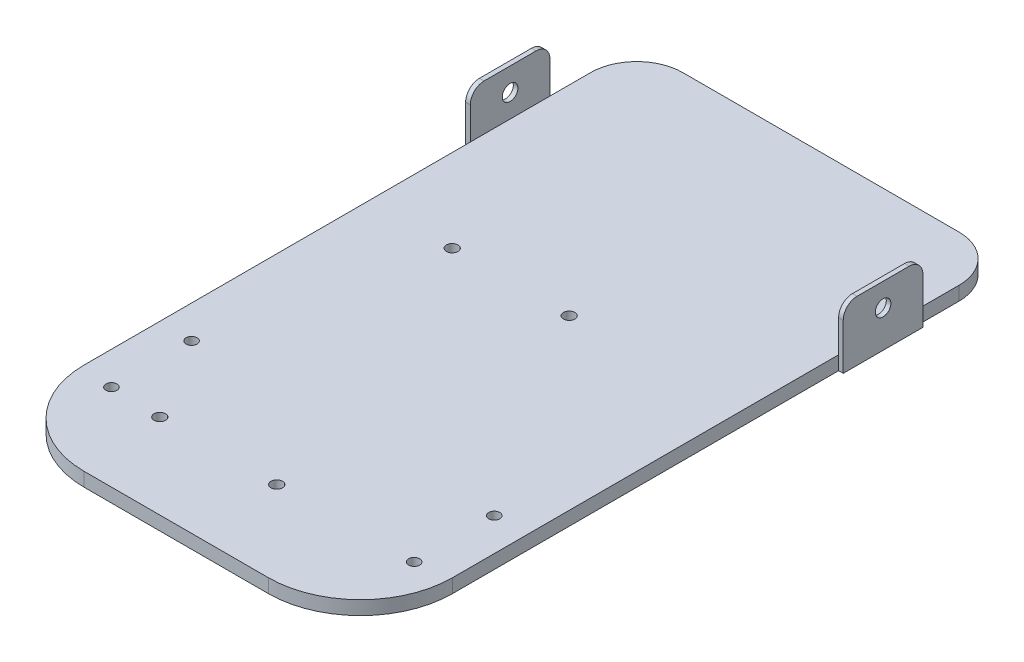
ISO-10303-21;
HEADER;
FILE_DESCRIPTION(('STEP AP214'),'2;1');
FILE_NAME('part.step','',(''),(''),'','','');
FILE_SCHEMA(('AUTOMOTIVE_DESIGN { 1 0 10303 214 1 1 1 1 }'));
ENDSEC;
DATA;
#1=APPLICATION_CONTEXT('core data for automotive mechanical design processes');
#2=APPLICATION_PROTOCOL_DEFINITION('international standard','automotive_design',2000,#1);
#3=PRODUCT_CONTEXT('',#1,'mechanical');
#4=PRODUCT('Part','Part','',(#3));
#5=PRODUCT_RELATED_PRODUCT_CATEGORY('part','',(#4));
#6=PRODUCT_DEFINITION_FORMATION('','',#4);
#7=PRODUCT_DEFINITION_CONTEXT('part definition',#1,'design');
#8=PRODUCT_DEFINITION('design','',#6,#7);
#9=PRODUCT_DEFINITION_SHAPE('','',#8);
#10=(LENGTH_UNIT() NAMED_UNIT(*) SI_UNIT(.MILLI.,.METRE.));
#11=(NAMED_UNIT(*) PLANE_ANGLE_UNIT() SI_UNIT($,.RADIAN.));
#12=(NAMED_UNIT(*) SI_UNIT($,.STERADIAN.) SOLID_ANGLE_UNIT());
#13=UNCERTAINTY_MEASURE_WITH_UNIT(LENGTH_MEASURE(1.E-05),#10,'distance_accuracy_value','');
#14=(GEOMETRIC_REPRESENTATION_CONTEXT(3) GLOBAL_UNCERTAINTY_ASSIGNED_CONTEXT((#13)) GLOBAL_UNIT_ASSIGNED_CONTEXT((#10,
#11,#12)) REPRESENTATION_CONTEXT('',''));
#15=CARTESIAN_POINT('',(0.,0.,0.));
#16=DIRECTION('',(0.,0.,1.));
#17=DIRECTION('',(1.,0.,0.));
#18=AXIS2_PLACEMENT_3D('',#15,#16,#17);
#19=CARTESIAN_POINT('',(41.,-3.,-68.6215298477543));
#20=DIRECTION('',(1.,0.,0.));
#21=DIRECTION('',(0.,0.,-1.));
#22=AXIS2_PLACEMENT_3D('',#19,#20,#21);
#23=PLANE('',#22);
#24=DIRECTION('',(0.,0.,1.));
#25=VECTOR('',#24,1.);
#26=CARTESIAN_POINT('',(41.,10.,-85.9215298477543));
#27=LINE('',#26,#25);
#28=CARTESIAN_POINT('',(41.,10.,-82.9215298477543));
#29=VERTEX_POINT('',#28);
#30=CARTESIAN_POINT('',(41.,10.,-71.6215298477543));
#31=VERTEX_POINT('',#30);
#32=EDGE_CURVE('E391',#29,#31,#27,.T.);
#33=ORIENTED_EDGE('',*,*,#32,.T.);
#34=CARTESIAN_POINT('',(41.,7.,-71.6215298477543));
#35=DIRECTION('',(1.,0.,0.));
#36=DIRECTION('',(0.,0.,-1.));
#37=AXIS2_PLACEMENT_3D('',#34,#35,#36);
#38=CIRCLE('',#37,3.);
#39=CARTESIAN_POINT('',(41.,7.,-68.6215298477543));
#40=VERTEX_POINT('',#39);
#41=EDGE_CURVE('E45',#31,#40,#38,.T.);
#42=ORIENTED_EDGE('',*,*,#41,.T.);
#43=DIRECTION('',(0.,1.,0.));
#44=VECTOR('',#43,1.);
#45=CARTESIAN_POINT('',(41.,-3.,-68.6215298477543));
#46=LINE('',#45,#44);
#47=CARTESIAN_POINT('',(41.,-3.,-68.6215298477543));
#48=VERTEX_POINT('',#47);
#49=EDGE_CURVE('E321',#48,#40,#46,.T.);
#50=ORIENTED_EDGE('',*,*,#49,.F.);
#51=DIRECTION('',(0.,0.,-1.));
#52=VECTOR('',#51,1.);
#53=CARTESIAN_POINT('',(41.,-3.,-68.6215298477543));
#54=LINE('',#53,#52);
#55=CARTESIAN_POINT('',(41.,-3.,-85.9215298477543));
#56=VERTEX_POINT('',#55);
#57=EDGE_CURVE('E277',#48,#56,#54,.T.);
#58=ORIENTED_EDGE('',*,*,#57,.T.);
#59=DIRECTION('',(0.,1.,0.));
#60=VECTOR('',#59,1.);
#61=CARTESIAN_POINT('',(41.,-3.,-85.9215298477543));
#62=LINE('',#61,#60);
#63=CARTESIAN_POINT('',(41.,7.,-85.9215298477543));
#64=VERTEX_POINT('',#63);
#65=EDGE_CURVE('E318',#56,#64,#62,.T.);
#66=ORIENTED_EDGE('',*,*,#65,.T.);
#67=CARTESIAN_POINT('',(41.,7.,-82.9215298477543));
#68=DIRECTION('',(1.,0.,0.));
#69=DIRECTION('',(0.,0.,-1.));
#70=AXIS2_PLACEMENT_3D('',#67,#68,#69);
#71=CIRCLE('',#70,3.);
#72=EDGE_CURVE('E52',#64,#29,#71,.T.);
#73=ORIENTED_EDGE('',*,*,#72,.T.);
#74=EDGE_LOOP('',(#33,#42,#50,#58,#66,#73));
#75=FACE_BOUND('',#74,.T.);
#76=CARTESIAN_POINT('',(41.,5.,-77.2715298477543));
#77=DIRECTION('',(1.,0.,0.));
#78=DIRECTION('',(0.,0.,-1.));
#79=AXIS2_PLACEMENT_3D('',#76,#77,#78);
#80=CIRCLE('',#79,1.7);
#81=CARTESIAN_POINT('',(41.,5.,-78.9715298477543));
#82=VERTEX_POINT('',#81);
#83=EDGE_CURVE('E416',#82,#82,#80,.T.);
#84=ORIENTED_EDGE('',*,*,#83,.F.);
#85=EDGE_LOOP('',(#84));
#86=FACE_BOUND('',#85,.T.);
#87=ADVANCED_FACE('F37',(#75,#86),#23,.T.);
#88=CARTESIAN_POINT('',(40.,10.,-85.9215298477543));
#89=DIRECTION('',(-1.,0.,0.));
#90=DIRECTION('',(0.,0.,1.));
#91=AXIS2_PLACEMENT_3D('',#88,#89,#90);
#92=PLANE('',#91);
#93=DIRECTION('',(0.,-1.,0.));
#94=VECTOR('',#93,1.);
#95=CARTESIAN_POINT('',(40.,10.,-68.6215298477543));
#96=LINE('',#95,#94);
#97=CARTESIAN_POINT('',(40.,7.,-68.6215298477543));
#98=VERTEX_POINT('',#97);
#99=CARTESIAN_POINT('',(40.,0.,-68.6215298477543));
#100=VERTEX_POINT('',#99);
#101=EDGE_CURVE('E407',#98,#100,#96,.T.);
#102=ORIENTED_EDGE('',*,*,#101,.F.);
#103=CARTESIAN_POINT('',(40.,7.,-71.6215298477543));
#104=DIRECTION('',(-1.,0.,0.));
#105=DIRECTION('',(0.,0.,1.));
#106=AXIS2_PLACEMENT_3D('',#103,#104,#105);
#107=CIRCLE('',#106,3.);
#108=CARTESIAN_POINT('',(40.,10.,-71.6215298477543));
#109=VERTEX_POINT('',#108);
#110=EDGE_CURVE('E382',#98,#109,#107,.T.);
#111=ORIENTED_EDGE('',*,*,#110,.T.);
#112=DIRECTION('',(0.,0.,-1.));
#113=VECTOR('',#112,1.);
#114=CARTESIAN_POINT('',(40.,10.,-85.9215298477543));
#115=LINE('',#114,#113);
#116=CARTESIAN_POINT('',(40.,10.,-82.9215298477543));
#117=VERTEX_POINT('',#116);
#118=EDGE_CURVE('E404',#109,#117,#115,.T.);
#119=ORIENTED_EDGE('',*,*,#118,.T.);
#120=CARTESIAN_POINT('',(40.,7.,-82.9215298477543));
#121=DIRECTION('',(-1.,0.,0.));
#122=DIRECTION('',(0.,0.,1.));
#123=AXIS2_PLACEMENT_3D('',#120,#121,#122);
#124=CIRCLE('',#123,3.);
#125=CARTESIAN_POINT('',(40.,7.,-85.9215298477543));
#126=VERTEX_POINT('',#125);
#127=EDGE_CURVE('E380',#117,#126,#124,.T.);
#128=ORIENTED_EDGE('',*,*,#127,.T.);
#129=DIRECTION('',(0.,-1.,0.));
#130=VECTOR('',#129,1.);
#131=CARTESIAN_POINT('',(40.,10.,-85.9215298477543));
#132=LINE('',#131,#130);
#133=CARTESIAN_POINT('',(40.,0.,-85.9215298477543));
#134=VERTEX_POINT('',#133);
#135=EDGE_CURVE('E410',#126,#134,#132,.T.);
#136=ORIENTED_EDGE('',*,*,#135,.T.);
#137=DIRECTION('',(0.,0.,-1.));
#138=VECTOR('',#137,1.);
#139=CARTESIAN_POINT('',(40.,0.,-85.9215298477543));
#140=LINE('',#139,#138);
#141=EDGE_CURVE('E412',#100,#134,#140,.T.);
#142=ORIENTED_EDGE('',*,*,#141,.F.);
#143=EDGE_LOOP('',(#102,#111,#119,#128,#136,#142));
#144=FACE_BOUND('',#143,.T.);
#145=CARTESIAN_POINT('',(40.,5.,-77.2715298477543));
#146=DIRECTION('',(1.,0.,0.));
#147=DIRECTION('',(0.,0.,-1.));
#148=AXIS2_PLACEMENT_3D('',#145,#146,#147);
#149=CIRCLE('',#148,1.7);
#150=CARTESIAN_POINT('',(40.,5.,-78.9715298477543));
#151=VERTEX_POINT('',#150);
#152=EDGE_CURVE('E803',#151,#151,#149,.T.);
#153=ORIENTED_EDGE('',*,*,#152,.T.);
#154=EDGE_LOOP('',(#153));
#155=FACE_BOUND('',#154,.T.);
#156=ADVANCED_FACE('F402',(#144,#155),#92,.T.);
#157=CARTESIAN_POINT('',(0.,-3.,0.));
#158=DIRECTION('',(0.,1.,0.));
#159=DIRECTION('',(0.,0.,1.));
#160=AXIS2_PLACEMENT_3D('',#157,#158,#159);
#161=PLANE('',#160);
#162=CARTESIAN_POINT('',(-22.,-3.,16.8002279588532));
#163=DIRECTION('',(0.,1.,0.));
#164=DIRECTION('',(0.,0.,1.));
#165=AXIS2_PLACEMENT_3D('',#162,#163,#164);
#166=CIRCLE('',#165,1.24999999999999);
#167=CARTESIAN_POINT('',(-22.,-3.,18.0502279588532));
#168=VERTEX_POINT('',#167);
#169=EDGE_CURVE('E778',#168,#168,#166,.T.);
#170=ORIENTED_EDGE('',*,*,#169,.T.);
#171=EDGE_LOOP('',(#170));
#172=FACE_BOUND('',#171,.T.);
#173=CARTESIAN_POINT('',(3.4,-3.,16.8002279588532));
#174=DIRECTION('',(0.,1.,0.));
#175=DIRECTION('',(0.,0.,1.));
#176=AXIS2_PLACEMENT_3D('',#173,#174,#175);
#177=CIRCLE('',#176,1.24999999999999);
#178=CARTESIAN_POINT('',(3.4,-3.,18.0502279588532));
#179=VERTEX_POINT('',#178);
#180=EDGE_CURVE('E788',#179,#179,#177,.T.);
#181=ORIENTED_EDGE('',*,*,#180,.T.);
#182=EDGE_LOOP('',(#181));
#183=FACE_BOUND('',#182,.T.);
#184=CARTESIAN_POINT('',(3.4,-3.,-46.6997720411468));
#185=DIRECTION('',(0.,1.,0.));
#186=DIRECTION('',(0.,0.,1.));
#187=AXIS2_PLACEMENT_3D('',#184,#185,#186);
#188=CIRCLE('',#187,1.24999999999999);
#189=CARTESIAN_POINT('',(3.4,-3.,-45.4497720411468));
#190=VERTEX_POINT('',#189);
#191=EDGE_CURVE('E794',#190,#190,#188,.T.);
#192=ORIENTED_EDGE('',*,*,#191,.T.);
#193=EDGE_LOOP('',(#192));
#194=FACE_BOUND('',#193,.T.);
#195=CARTESIAN_POINT('',(-22.,-3.,-46.6997720411468));
#196=DIRECTION('',(0.,1.,0.));
#197=DIRECTION('',(0.,0.,1.));
#198=AXIS2_PLACEMENT_3D('',#195,#196,#197);
#199=CIRCLE('',#198,1.24999999999999);
#200=CARTESIAN_POINT('',(-22.,-3.,-45.4497720411468));
#201=VERTEX_POINT('',#200);
#202=EDGE_CURVE('E800',#201,#201,#199,.T.);
#203=ORIENTED_EDGE('',*,*,#202,.T.);
#204=EDGE_LOOP('',(#203));
#205=FACE_BOUND('',#204,.T.);
#206=CARTESIAN_POINT('',(32.87,-3.,16.4284701522457));
#207=DIRECTION('',(0.,-1.,0.));
#208=DIRECTION('',(0.,0.,1.));
#209=AXIS2_PLACEMENT_3D('',#206,#207,#208);
#210=CIRCLE('',#209,1.2);
#211=CARTESIAN_POINT('',(32.87,-3.,17.6284701522457));
#212=VERTEX_POINT('',#211);
#213=EDGE_CURVE('E248',#212,#212,#210,.T.);
#214=ORIENTED_EDGE('',*,*,#213,.F.);
#215=EDGE_LOOP('',(#214));
#216=FACE_BOUND('',#215,.T.);
#217=CARTESIAN_POINT('',(-32.87,-3.,-0.971529847754317));
#218=DIRECTION('',(0.,1.,0.));
#219=DIRECTION('',(0.,0.,-1.));
#220=AXIS2_PLACEMENT_3D('',#217,#218,#219);
#221=CIRCLE('',#220,1.2);
#222=CARTESIAN_POINT('',(-32.87,-3.,-2.17152984775432));
#223=VERTEX_POINT('',#222);
#224=EDGE_CURVE('E254',#223,#223,#221,.T.);
#225=ORIENTED_EDGE('',*,*,#224,.T.);
#226=EDGE_LOOP('',(#225));
#227=FACE_BOUND('',#226,.T.);
#228=CARTESIAN_POINT('',(-32.87,-3.,16.4284701522457));
#229=DIRECTION('',(0.,1.,0.));
#230=DIRECTION('',(0.,0.,1.));
#231=AXIS2_PLACEMENT_3D('',#228,#229,#230);
#232=CIRCLE('',#231,1.2);
#233=CARTESIAN_POINT('',(-32.87,-3.,17.6284701522457));
#234=VERTEX_POINT('',#233);
#235=EDGE_CURVE('E260',#234,#234,#232,.T.);
#236=ORIENTED_EDGE('',*,*,#235,.T.);
#237=EDGE_LOOP('',(#236));
#238=FACE_BOUND('',#237,.T.);
#239=DIRECTION('',(-1.,0.,0.));
#240=VECTOR('',#239,1.);
#241=CARTESIAN_POINT('',(-40.,-3.,-104.771529847754));
#242=LINE('',#241,#240);
#243=CARTESIAN_POINT('',(30.,-3.,-104.771529847754));
#244=VERTEX_POINT('',#243);
#245=CARTESIAN_POINT('',(-30.,-3.,-104.771529847754));
#246=VERTEX_POINT('',#245);
#247=EDGE_CURVE('E286',#244,#246,#242,.T.);
#248=ORIENTED_EDGE('',*,*,#247,.F.);
#249=CARTESIAN_POINT('',(30.,-3.,-94.7715298477543));
#250=DIRECTION('',(0.,1.,0.));
#251=DIRECTION('',(0.,0.,1.));
#252=AXIS2_PLACEMENT_3D('',#249,#250,#251);
#253=CIRCLE('',#252,10.);
#254=CARTESIAN_POINT('',(40.,-3.,-94.7715298477543));
#255=VERTEX_POINT('',#254);
#256=EDGE_CURVE('E356',#244,#255,#253,.F.);
#257=ORIENTED_EDGE('',*,*,#256,.T.);
#258=DIRECTION('',(0.,0.,-1.));
#259=VECTOR('',#258,1.);
#260=CARTESIAN_POINT('',(40.,-3.,-85.9215298477543));
#261=LINE('',#260,#259);
#262=CARTESIAN_POINT('',(40.,-3.,-85.9215298477543));
#263=VERTEX_POINT('',#262);
#264=EDGE_CURVE('E283',#263,#255,#261,.T.);
#265=ORIENTED_EDGE('',*,*,#264,.F.);
#266=DIRECTION('',(-1.,0.,0.));
#267=VECTOR('',#266,1.);
#268=CARTESIAN_POINT('',(41.,-3.,-85.9215298477543));
#269=LINE('',#268,#267);
#270=EDGE_CURVE('E280',#56,#263,#269,.T.);
#271=ORIENTED_EDGE('',*,*,#270,.F.);
#272=ORIENTED_EDGE('',*,*,#57,.F.);
#273=DIRECTION('',(1.,0.,0.));
#274=VECTOR('',#273,1.);
#275=CARTESIAN_POINT('',(40.,-3.,-68.6215298477543));
#276=LINE('',#275,#274);
#277=CARTESIAN_POINT('',(40.,-3.,-68.6215298477543));
#278=VERTEX_POINT('',#277);
#279=EDGE_CURVE('E274',#278,#48,#276,.T.);
#280=ORIENTED_EDGE('',*,*,#279,.F.);
#281=DIRECTION('',(0.,0.,-1.));
#282=VECTOR('',#281,1.);
#283=CARTESIAN_POINT('',(40.,-3.,35.2284701522457));
#284=LINE('',#283,#282);
#285=CARTESIAN_POINT('',(40.,-3.,15.2284701522457));
#286=VERTEX_POINT('',#285);
#287=EDGE_CURVE('E272',#286,#278,#284,.T.);
#288=ORIENTED_EDGE('',*,*,#287,.F.);
#289=CARTESIAN_POINT('',(20.,-3.,15.2284701522457));
#290=DIRECTION('',(0.,1.,0.));
#291=DIRECTION('',(0.,0.,1.));
#292=AXIS2_PLACEMENT_3D('',#289,#290,#291);
#293=CIRCLE('',#292,20.);
#294=CARTESIAN_POINT('',(20.,-3.,35.2284701522457));
#295=VERTEX_POINT('',#294);
#296=EDGE_CURVE('E341',#286,#295,#293,.F.);
#297=ORIENTED_EDGE('',*,*,#296,.T.);
#298=DIRECTION('',(1.,0.,0.));
#299=VECTOR('',#298,1.);
#300=CARTESIAN_POINT('',(40.,-3.,35.2284701522457));
#301=LINE('',#300,#299);
#302=CARTESIAN_POINT('',(-20.,-3.,35.2284701522457));
#303=VERTEX_POINT('',#302);
#304=EDGE_CURVE('E269',#303,#295,#301,.T.);
#305=ORIENTED_EDGE('',*,*,#304,.F.);
#306=CARTESIAN_POINT('',(-20.,-3.,15.2284701522457));
#307=DIRECTION('',(0.,1.,0.));
#308=DIRECTION('',(0.,0.,1.));
#309=AXIS2_PLACEMENT_3D('',#306,#307,#308);
#310=CIRCLE('',#309,20.);
#311=CARTESIAN_POINT('',(-40.,-3.,15.2284701522457));
#312=VERTEX_POINT('',#311);
#313=EDGE_CURVE('E332',#303,#312,#310,.F.);
#314=ORIENTED_EDGE('',*,*,#313,.T.);
#315=DIRECTION('',(0.,0.,1.));
#316=VECTOR('',#315,1.);
#317=CARTESIAN_POINT('',(-40.,-3.,35.2284701522457));
#318=LINE('',#317,#316);
#319=CARTESIAN_POINT('',(-40.,-3.,-68.6215298477543));
#320=VERTEX_POINT('',#319);
#321=EDGE_CURVE('E266',#320,#312,#318,.T.);
#322=ORIENTED_EDGE('',*,*,#321,.F.);
#323=DIRECTION('',(1.,0.,0.));
#324=VECTOR('',#323,1.);
#325=CARTESIAN_POINT('',(-40.,-3.,-68.6215298477543));
#326=LINE('',#325,#324);
#327=CARTESIAN_POINT('',(-41.,-3.,-68.6215298477543));
#328=VERTEX_POINT('',#327);
#329=EDGE_CURVE('E295',#328,#320,#326,.T.);
#330=ORIENTED_EDGE('',*,*,#329,.F.);
#331=DIRECTION('',(0.,0.,1.));
#332=VECTOR('',#331,1.);
#333=CARTESIAN_POINT('',(-41.,-3.,-68.6215298477543));
#334=LINE('',#333,#332);
#335=CARTESIAN_POINT('',(-41.,-3.,-85.9215298477543));
#336=VERTEX_POINT('',#335);
#337=EDGE_CURVE('E292',#336,#328,#334,.T.);
#338=ORIENTED_EDGE('',*,*,#337,.F.);
#339=DIRECTION('',(-1.,0.,0.));
#340=VECTOR('',#339,1.);
#341=CARTESIAN_POINT('',(-41.,-3.,-85.9215298477543));
#342=LINE('',#341,#340);
#343=CARTESIAN_POINT('',(-40.,-3.,-85.9215298477543));
#344=VERTEX_POINT('',#343);
#345=EDGE_CURVE('E290',#344,#336,#342,.T.);
#346=ORIENTED_EDGE('',*,*,#345,.F.);
#347=DIRECTION('',(0.,0.,1.));
#348=VECTOR('',#347,1.);
#349=CARTESIAN_POINT('',(-40.,-3.,-85.9215298477543));
#350=LINE('',#349,#348);
#351=CARTESIAN_POINT('',(-40.,-3.,-94.7715298477543));
#352=VERTEX_POINT('',#351);
#353=EDGE_CURVE('E210',#352,#344,#350,.T.);
#354=ORIENTED_EDGE('',*,*,#353,.F.);
#355=CARTESIAN_POINT('',(-30.,-3.,-94.7715298477543));
#356=DIRECTION('',(0.,1.,0.));
#357=DIRECTION('',(0.,0.,1.));
#358=AXIS2_PLACEMENT_3D('',#355,#356,#357);
#359=CIRCLE('',#358,10.);
#360=EDGE_CURVE('E354',#352,#246,#359,.F.);
#361=ORIENTED_EDGE('',*,*,#360,.T.);
#362=EDGE_LOOP('',(#248,#257,#265,#271,#272,#280,#288,#297,#305,#314,#322,#330,#338,#346,#354,#361));
#363=FACE_BOUND('',#362,.T.);
#364=CARTESIAN_POINT('',(32.87,-3.,-0.971529847754317));
#365=DIRECTION('',(0.,-1.,0.));
#366=DIRECTION('',(0.,0.,-1.));
#367=AXIS2_PLACEMENT_3D('',#364,#365,#366);
#368=CIRCLE('',#367,1.2);
#369=CARTESIAN_POINT('',(32.87,-3.,-2.17152984775432));
#370=VERTEX_POINT('',#369);
#371=EDGE_CURVE('E242',#370,#370,#368,.T.);
#372=ORIENTED_EDGE('',*,*,#371,.F.);
#373=EDGE_LOOP('',(#372));
#374=FACE_BOUND('',#373,.T.);
#375=ADVANCED_FACE('F442',(#172,#183,#194,#205,#216,#227,#238,#363,#374),#161,.F.);
#376=CARTESIAN_POINT('',(0.,0.,0.));
#377=DIRECTION('',(0.,1.,0.));
#378=DIRECTION('',(0.,0.,1.));
#379=AXIS2_PLACEMENT_3D('',#376,#377,#378);
#380=PLANE('',#379);
#381=CARTESIAN_POINT('',(-22.,0.,16.8002279588532));
#382=DIRECTION('',(0.,1.,0.));
#383=DIRECTION('',(0.,0.,1.));
#384=AXIS2_PLACEMENT_3D('',#381,#382,#383);
#385=CIRCLE('',#384,1.24999999999999);
#386=CARTESIAN_POINT('',(-22.,0.,18.0502279588532));
#387=VERTEX_POINT('',#386);
#388=EDGE_CURVE('E781',#387,#387,#385,.T.);
#389=ORIENTED_EDGE('',*,*,#388,.F.);
#390=EDGE_LOOP('',(#389));
#391=FACE_BOUND('',#390,.T.);
#392=CARTESIAN_POINT('',(3.4,0.,16.8002279588532));
#393=DIRECTION('',(0.,1.,0.));
#394=DIRECTION('',(0.,0.,1.));
#395=AXIS2_PLACEMENT_3D('',#392,#393,#394);
#396=CIRCLE('',#395,1.24999999999999);
#397=CARTESIAN_POINT('',(3.4,0.,18.0502279588532));
#398=VERTEX_POINT('',#397);
#399=EDGE_CURVE('E783',#398,#398,#396,.T.);
#400=ORIENTED_EDGE('',*,*,#399,.F.);
#401=EDGE_LOOP('',(#400));
#402=FACE_BOUND('',#401,.T.);
#403=CARTESIAN_POINT('',(3.4,0.,-46.6997720411468));
#404=DIRECTION('',(0.,1.,0.));
#405=DIRECTION('',(0.,0.,1.));
#406=AXIS2_PLACEMENT_3D('',#403,#404,#405);
#407=CIRCLE('',#406,1.24999999999999);
#408=CARTESIAN_POINT('',(3.4,0.,-45.4497720411468));
#409=VERTEX_POINT('',#408);
#410=EDGE_CURVE('E791',#409,#409,#407,.T.);
#411=ORIENTED_EDGE('',*,*,#410,.F.);
#412=EDGE_LOOP('',(#411));
#413=FACE_BOUND('',#412,.T.);
#414=CARTESIAN_POINT('',(-22.,0.,-46.6997720411468));
#415=DIRECTION('',(0.,1.,0.));
#416=DIRECTION('',(0.,0.,1.));
#417=AXIS2_PLACEMENT_3D('',#414,#415,#416);
#418=CIRCLE('',#417,1.24999999999999);
#419=CARTESIAN_POINT('',(-22.,0.,-45.4497720411468));
#420=VERTEX_POINT('',#419);
#421=EDGE_CURVE('E797',#420,#420,#418,.T.);
#422=ORIENTED_EDGE('',*,*,#421,.F.);
#423=EDGE_LOOP('',(#422));
#424=FACE_BOUND('',#423,.T.);
#425=ORIENTED_EDGE('',*,*,#141,.T.);
#426=DIRECTION('',(0.,0.,-1.));
#427=VECTOR('',#426,1.);
#428=CARTESIAN_POINT('',(40.,0.,-85.9215298477543));
#429=LINE('',#428,#427);
#430=CARTESIAN_POINT('',(40.,0.,-94.7715298477543));
#431=VERTEX_POINT('',#430);
#432=EDGE_CURVE('E304',#134,#431,#429,.T.);
#433=ORIENTED_EDGE('',*,*,#432,.T.);
#434=CARTESIAN_POINT('',(30.,0.,-94.7715298477543));
#435=DIRECTION('',(0.,1.,0.));
#436=DIRECTION('',(0.,0.,1.));
#437=AXIS2_PLACEMENT_3D('',#434,#435,#436);
#438=CIRCLE('',#437,10.);
#439=CARTESIAN_POINT('',(30.,0.,-104.771529847754));
#440=VERTEX_POINT('',#439);
#441=EDGE_CURVE('E347',#431,#440,#438,.T.);
#442=ORIENTED_EDGE('',*,*,#441,.T.);
#443=DIRECTION('',(-1.,0.,0.));
#444=VECTOR('',#443,1.);
#445=CARTESIAN_POINT('',(-40.,0.,-104.771529847754));
#446=LINE('',#445,#444);
#447=CARTESIAN_POINT('',(-30.,0.,-104.771529847754));
#448=VERTEX_POINT('',#447);
#449=EDGE_CURVE('E225',#440,#448,#446,.T.);
#450=ORIENTED_EDGE('',*,*,#449,.T.);
#451=CARTESIAN_POINT('',(-30.,0.,-94.7715298477543));
#452=DIRECTION('',(0.,1.,0.));
#453=DIRECTION('',(0.,0.,1.));
#454=AXIS2_PLACEMENT_3D('',#451,#452,#453);
#455=CIRCLE('',#454,10.);
#456=CARTESIAN_POINT('',(-40.,0.,-94.7715298477543));
#457=VERTEX_POINT('',#456);
#458=EDGE_CURVE('E223',#448,#457,#455,.T.);
#459=ORIENTED_EDGE('',*,*,#458,.T.);
#460=DIRECTION('',(0.,0.,1.));
#461=VECTOR('',#460,1.);
#462=CARTESIAN_POINT('',(-40.,0.,-85.9215298477543));
#463=LINE('',#462,#461);
#464=CARTESIAN_POINT('',(-40.,0.,-85.9215298477543));
#465=VERTEX_POINT('',#464);
#466=EDGE_CURVE('E207',#457,#465,#463,.T.);
#467=ORIENTED_EDGE('',*,*,#466,.T.);
#468=DIRECTION('',(0.,0.,-1.));
#469=VECTOR('',#468,1.);
#470=CARTESIAN_POINT('',(-40.,0.,-85.9215298477543));
#471=LINE('',#470,#469);
#472=CARTESIAN_POINT('',(-40.,0.,-68.6215298477543));
#473=VERTEX_POINT('',#472);
#474=EDGE_CURVE('E220',#473,#465,#471,.T.);
#475=ORIENTED_EDGE('',*,*,#474,.F.);
#476=DIRECTION('',(0.,0.,1.));
#477=VECTOR('',#476,1.);
#478=CARTESIAN_POINT('',(-40.,0.,16.3784701522457));
#479=LINE('',#478,#477);
#480=CARTESIAN_POINT('',(-40.,0.,15.2284701522457));
#481=VERTEX_POINT('',#480);
#482=EDGE_CURVE('E224',#473,#481,#479,.T.);
#483=ORIENTED_EDGE('',*,*,#482,.T.);
#484=CARTESIAN_POINT('',(-20.,0.,15.2284701522457));
#485=DIRECTION('',(0.,1.,0.));
#486=DIRECTION('',(0.,0.,1.));
#487=AXIS2_PLACEMENT_3D('',#484,#485,#486);
#488=CIRCLE('',#487,20.);
#489=CARTESIAN_POINT('',(-20.,0.,35.2284701522457));
#490=VERTEX_POINT('',#489);
#491=EDGE_CURVE('E328',#481,#490,#488,.T.);
#492=ORIENTED_EDGE('',*,*,#491,.T.);
#493=DIRECTION('',(1.,0.,0.));
#494=VECTOR('',#493,1.);
#495=CARTESIAN_POINT('',(40.,0.,35.2284701522457));
#496=LINE('',#495,#494);
#497=CARTESIAN_POINT('',(20.,0.,35.2284701522457));
#498=VERTEX_POINT('',#497);
#499=EDGE_CURVE('E263',#490,#498,#496,.T.);
#500=ORIENTED_EDGE('',*,*,#499,.T.);
#501=CARTESIAN_POINT('',(20.,0.,15.2284701522457));
#502=DIRECTION('',(0.,1.,0.));
#503=DIRECTION('',(0.,0.,1.));
#504=AXIS2_PLACEMENT_3D('',#501,#502,#503);
#505=CIRCLE('',#504,20.);
#506=CARTESIAN_POINT('',(40.,0.,15.2284701522457));
#507=VERTEX_POINT('',#506);
#508=EDGE_CURVE('E337',#498,#507,#505,.T.);
#509=ORIENTED_EDGE('',*,*,#508,.T.);
#510=DIRECTION('',(0.,0.,-1.));
#511=VECTOR('',#510,1.);
#512=CARTESIAN_POINT('',(40.,0.,16.3784701522457));
#513=LINE('',#512,#511);
#514=EDGE_CURVE('E301',#507,#100,#513,.T.);
#515=ORIENTED_EDGE('',*,*,#514,.T.);
#516=EDGE_LOOP('',(#425,#433,#442,#450,#459,#467,#475,#483,#492,#500,#509,#515));
#517=FACE_BOUND('',#516,.T.);
#518=CARTESIAN_POINT('',(32.87,0.,16.4284701522457));
#519=DIRECTION('',(0.,-1.,0.));
#520=DIRECTION('',(0.,0.,1.));
#521=AXIS2_PLACEMENT_3D('',#518,#519,#520);
#522=CIRCLE('',#521,1.2);
#523=CARTESIAN_POINT('',(32.87,0.,17.6284701522457));
#524=VERTEX_POINT('',#523);
#525=EDGE_CURVE('E245',#524,#524,#522,.T.);
#526=ORIENTED_EDGE('',*,*,#525,.T.);
#527=EDGE_LOOP('',(#526));
#528=FACE_BOUND('',#527,.T.);
#529=CARTESIAN_POINT('',(-32.87,0.,-0.971529847754317));
#530=DIRECTION('',(0.,1.,0.));
#531=DIRECTION('',(0.,0.,-1.));
#532=AXIS2_PLACEMENT_3D('',#529,#530,#531);
#533=CIRCLE('',#532,1.2);
#534=CARTESIAN_POINT('',(-32.87,0.,-2.17152984775432));
#535=VERTEX_POINT('',#534);
#536=EDGE_CURVE('E251',#535,#535,#533,.T.);
#537=ORIENTED_EDGE('',*,*,#536,.F.);
#538=EDGE_LOOP('',(#537));
#539=FACE_BOUND('',#538,.T.);
#540=CARTESIAN_POINT('',(-32.87,0.,16.4284701522457));
#541=DIRECTION('',(0.,1.,0.));
#542=DIRECTION('',(0.,0.,1.));
#543=AXIS2_PLACEMENT_3D('',#540,#541,#542);
#544=CIRCLE('',#543,1.2);
#545=CARTESIAN_POINT('',(-32.87,0.,17.6284701522457));
#546=VERTEX_POINT('',#545);
#547=EDGE_CURVE('E257',#546,#546,#544,.T.);
#548=ORIENTED_EDGE('',*,*,#547,.F.);
#549=EDGE_LOOP('',(#548));
#550=FACE_BOUND('',#549,.T.);
#551=CARTESIAN_POINT('',(32.87,0.,-0.971529847754317));
#552=DIRECTION('',(0.,-1.,0.));
#553=DIRECTION('',(0.,0.,-1.));
#554=AXIS2_PLACEMENT_3D('',#551,#552,#553);
#555=CIRCLE('',#554,1.2);
#556=CARTESIAN_POINT('',(32.87,0.,-2.17152984775432));
#557=VERTEX_POINT('',#556);
#558=EDGE_CURVE('E241',#557,#557,#555,.T.);
#559=ORIENTED_EDGE('',*,*,#558,.T.);
#560=EDGE_LOOP('',(#559));
#561=FACE_BOUND('',#560,.T.);
#562=ADVANCED_FACE('F217',(#391,#402,#413,#424,#517,#528,#539,#550,#561),#380,.T.);
#563=CARTESIAN_POINT('',(-40.,-3.,16.3784701522457));
#564=DIRECTION('',(-1.,0.,0.));
#565=DIRECTION('',(0.,0.,1.));
#566=AXIS2_PLACEMENT_3D('',#563,#564,#565);
#567=PLANE('',#566);
#568=ORIENTED_EDGE('',*,*,#321,.T.);
#569=DIRECTION('',(0.,1.,0.));
#570=VECTOR('',#569,1.);
#571=CARTESIAN_POINT('',(-40.,-3.,15.2284701522457));
#572=LINE('',#571,#570);
#573=EDGE_CURVE('E311',#312,#481,#572,.T.);
#574=ORIENTED_EDGE('',*,*,#573,.T.);
#575=ORIENTED_EDGE('',*,*,#482,.F.);
#576=DIRECTION('',(0.,1.,0.));
#577=VECTOR('',#576,1.);
#578=CARTESIAN_POINT('',(-40.,-3.,-68.6215298477543));
#579=LINE('',#578,#577);
#580=EDGE_CURVE('E309',#320,#473,#579,.T.);
#581=ORIENTED_EDGE('',*,*,#580,.F.);
#582=EDGE_LOOP('',(#568,#574,#575,#581));
#583=FACE_BOUND('',#582,.T.);
#584=ADVANCED_FACE('F527',(#583),#567,.T.);
#585=CARTESIAN_POINT('',(-40.,-3.,-68.6215298477543));
#586=DIRECTION('',(0.,0.,1.));
#587=DIRECTION('',(1.,0.,0.));
#588=AXIS2_PLACEMENT_3D('',#585,#586,#587);
#589=PLANE('',#588);
#590=DIRECTION('',(0.,-1.,0.));
#591=VECTOR('',#590,1.);
#592=CARTESIAN_POINT('',(-40.,10.,-68.6215298477543));
#593=LINE('',#592,#591);
#594=CARTESIAN_POINT('',(-40.,7.,-68.6215298477543));
#595=VERTEX_POINT('',#594);
#596=EDGE_CURVE('E200',#595,#473,#593,.T.);
#597=ORIENTED_EDGE('',*,*,#596,.F.);
#598=DIRECTION('',(1.,0.,0.));
#599=VECTOR('',#598,1.);
#600=CARTESIAN_POINT('',(-40.,7.,-68.6215298477543));
#601=LINE('',#600,#599);
#602=CARTESIAN_POINT('',(-41.,7.,-68.6215298477543));
#603=VERTEX_POINT('',#602);
#604=EDGE_CURVE('E370',#595,#603,#601,.F.);
#605=ORIENTED_EDGE('',*,*,#604,.T.);
#606=DIRECTION('',(0.,1.,0.));
#607=VECTOR('',#606,1.);
#608=CARTESIAN_POINT('',(-41.,-3.,-68.6215298477543));
#609=LINE('',#608,#607);
#610=EDGE_CURVE('E312',#328,#603,#609,.T.);
#611=ORIENTED_EDGE('',*,*,#610,.F.);
#612=ORIENTED_EDGE('',*,*,#329,.T.);
#613=ORIENTED_EDGE('',*,*,#580,.T.);
#614=EDGE_LOOP('',(#597,#605,#611,#612,#613));
#615=FACE_BOUND('',#614,.T.);
#616=ADVANCED_FACE('F509',(#615),#589,.T.);
#617=CARTESIAN_POINT('',(-41.,-3.,-68.6215298477543));
#618=DIRECTION('',(-1.,0.,0.));
#619=DIRECTION('',(0.,0.,1.));
#620=AXIS2_PLACEMENT_3D('',#617,#618,#619);
#621=PLANE('',#620);
#622=CARTESIAN_POINT('',(-41.,5.,-77.2715298477543));
#623=DIRECTION('',(1.,0.,0.));
#624=DIRECTION('',(0.,0.,-1.));
#625=AXIS2_PLACEMENT_3D('',#622,#623,#624);
#626=CIRCLE('',#625,1.7);
#627=CARTESIAN_POINT('',(-41.,5.,-78.9715298477543));
#628=VERTEX_POINT('',#627);
#629=EDGE_CURVE('E231',#628,#628,#626,.T.);
#630=ORIENTED_EDGE('',*,*,#629,.T.);
#631=EDGE_LOOP('',(#630));
#632=FACE_BOUND('',#631,.T.);
#633=ORIENTED_EDGE('',*,*,#610,.T.);
#634=CARTESIAN_POINT('',(-41.,7.,-71.6215298477543));
#635=DIRECTION('',(-1.,0.,0.));
#636=DIRECTION('',(0.,0.,1.));
#637=AXIS2_PLACEMENT_3D('',#634,#635,#636);
#638=CIRCLE('',#637,3.);
#639=CARTESIAN_POINT('',(-41.,10.,-71.6215298477543));
#640=VERTEX_POINT('',#639);
#641=EDGE_CURVE('E374',#603,#640,#638,.T.);
#642=ORIENTED_EDGE('',*,*,#641,.T.);
#643=DIRECTION('',(0.,0.,1.));
#644=VECTOR('',#643,1.);
#645=CARTESIAN_POINT('',(-41.,10.,-85.9215298477543));
#646=LINE('',#645,#644);
#647=CARTESIAN_POINT('',(-41.,10.,-82.9215298477543));
#648=VERTEX_POINT('',#647);
#649=EDGE_CURVE('E230',#648,#640,#646,.T.);
#650=ORIENTED_EDGE('',*,*,#649,.F.);
#651=CARTESIAN_POINT('',(-41.,7.,-82.9215298477543));
#652=DIRECTION('',(-1.,0.,0.));
#653=DIRECTION('',(0.,0.,1.));
#654=AXIS2_PLACEMENT_3D('',#651,#652,#653);
#655=CIRCLE('',#654,3.);
#656=CARTESIAN_POINT('',(-41.,7.,-85.9215298477543));
#657=VERTEX_POINT('',#656);
#658=EDGE_CURVE('E372',#648,#657,#655,.T.);
#659=ORIENTED_EDGE('',*,*,#658,.T.);
#660=DIRECTION('',(0.,1.,0.));
#661=VECTOR('',#660,1.);
#662=CARTESIAN_POINT('',(-41.,-3.,-85.9215298477543));
#663=LINE('',#662,#661);
#664=EDGE_CURVE('E211',#336,#657,#663,.T.);
#665=ORIENTED_EDGE('',*,*,#664,.F.);
#666=ORIENTED_EDGE('',*,*,#337,.T.);
#667=EDGE_LOOP('',(#633,#642,#650,#659,#665,#666));
#668=FACE_BOUND('',#667,.T.);
#669=ADVANCED_FACE('F506',(#632,#668),#621,.T.);
#670=CARTESIAN_POINT('',(-41.,-3.,-85.9215298477543));
#671=DIRECTION('',(0.,0.,-1.));
#672=DIRECTION('',(-1.,0.,0.));
#673=AXIS2_PLACEMENT_3D('',#670,#671,#672);
#674=PLANE('',#673);
#675=ORIENTED_EDGE('',*,*,#664,.T.);
#676=DIRECTION('',(-1.,0.,0.));
#677=VECTOR('',#676,1.);
#678=CARTESIAN_POINT('',(-41.,7.,-85.9215298477543));
#679=LINE('',#678,#677);
#680=CARTESIAN_POINT('',(-40.,7.,-85.9215298477543));
#681=VERTEX_POINT('',#680);
#682=EDGE_CURVE('E196',#657,#681,#679,.F.);
#683=ORIENTED_EDGE('',*,*,#682,.T.);
#684=DIRECTION('',(0.,-1.,0.));
#685=VECTOR('',#684,1.);
#686=CARTESIAN_POINT('',(-40.,10.,-85.9215298477543));
#687=LINE('',#686,#685);
#688=EDGE_CURVE('E188',#681,#465,#687,.T.);
#689=ORIENTED_EDGE('',*,*,#688,.T.);
#690=DIRECTION('',(0.,1.,0.));
#691=VECTOR('',#690,1.);
#692=CARTESIAN_POINT('',(-40.,-3.,-85.9215298477543));
#693=LINE('',#692,#691);
#694=EDGE_CURVE('E193',#344,#465,#693,.T.);
#695=ORIENTED_EDGE('',*,*,#694,.F.);
#696=ORIENTED_EDGE('',*,*,#345,.T.);
#697=EDGE_LOOP('',(#675,#683,#689,#695,#696));
#698=FACE_BOUND('',#697,.T.);
#699=ADVANCED_FACE('F191',(#698),#674,.T.);
#700=CARTESIAN_POINT('',(-40.,-3.,-85.9215298477543));
#701=DIRECTION('',(-1.,0.,0.));
#702=DIRECTION('',(0.,0.,1.));
#703=AXIS2_PLACEMENT_3D('',#700,#701,#702);
#704=PLANE('',#703);
#705=ORIENTED_EDGE('',*,*,#466,.F.);
#706=DIRECTION('',(0.,1.,0.));
#707=VECTOR('',#706,1.);
#708=CARTESIAN_POINT('',(-40.,-3.,-94.7715298477543));
#709=LINE('',#708,#707);
#710=EDGE_CURVE('E358',#457,#352,#709,.F.);
#711=ORIENTED_EDGE('',*,*,#710,.T.);
#712=ORIENTED_EDGE('',*,*,#353,.T.);
#713=ORIENTED_EDGE('',*,*,#694,.T.);
#714=EDGE_LOOP('',(#705,#711,#712,#713));
#715=FACE_BOUND('',#714,.T.);
#716=ADVANCED_FACE('F206',(#715),#704,.T.);
#717=CARTESIAN_POINT('',(-40.,-3.,-104.771529847754));
#718=DIRECTION('',(0.,0.,-1.));
#719=DIRECTION('',(-1.,0.,0.));
#720=AXIS2_PLACEMENT_3D('',#717,#718,#719);
#721=PLANE('',#720);
#722=ORIENTED_EDGE('',*,*,#449,.F.);
#723=DIRECTION('',(0.,1.,0.));
#724=VECTOR('',#723,1.);
#725=CARTESIAN_POINT('',(30.,-3.,-104.771529847754));
#726=LINE('',#725,#724);
#727=EDGE_CURVE('E352',#440,#244,#726,.F.);
#728=ORIENTED_EDGE('',*,*,#727,.T.);
#729=ORIENTED_EDGE('',*,*,#247,.T.);
#730=DIRECTION('',(0.,1.,0.));
#731=VECTOR('',#730,1.);
#732=CARTESIAN_POINT('',(-30.,-3.,-104.771529847754));
#733=LINE('',#732,#731);
#734=EDGE_CURVE('E349',#246,#448,#733,.T.);
#735=ORIENTED_EDGE('',*,*,#734,.T.);
#736=EDGE_LOOP('',(#722,#728,#729,#735));
#737=FACE_BOUND('',#736,.T.);
#738=ADVANCED_FACE('F550',(#737),#721,.T.);
#739=CARTESIAN_POINT('',(40.,-3.,-85.9215298477543));
#740=DIRECTION('',(1.,0.,0.));
#741=DIRECTION('',(0.,0.,-1.));
#742=AXIS2_PLACEMENT_3D('',#739,#740,#741);
#743=PLANE('',#742);
#744=ORIENTED_EDGE('',*,*,#264,.T.);
#745=DIRECTION('',(0.,1.,0.));
#746=VECTOR('',#745,1.);
#747=CARTESIAN_POINT('',(40.,-3.,-94.7715298477543));
#748=LINE('',#747,#746);
#749=EDGE_CURVE('E343',#255,#431,#748,.T.);
#750=ORIENTED_EDGE('',*,*,#749,.T.);
#751=ORIENTED_EDGE('',*,*,#432,.F.);
#752=DIRECTION('',(0.,1.,0.));
#753=VECTOR('',#752,1.);
#754=CARTESIAN_POINT('',(40.,-3.,-85.9215298477543));
#755=LINE('',#754,#753);
#756=EDGE_CURVE('E212',#263,#134,#755,.T.);
#757=ORIENTED_EDGE('',*,*,#756,.F.);
#758=EDGE_LOOP('',(#744,#750,#751,#757));
#759=FACE_BOUND('',#758,.T.);
#760=ADVANCED_FACE('F544',(#759),#743,.T.);
#761=CARTESIAN_POINT('',(41.,-3.,-85.9215298477543));
#762=DIRECTION('',(0.,0.,-1.));
#763=DIRECTION('',(-1.,0.,0.));
#764=AXIS2_PLACEMENT_3D('',#761,#762,#763);
#765=PLANE('',#764);
#766=ORIENTED_EDGE('',*,*,#135,.F.);
#767=DIRECTION('',(1.,0.,0.));
#768=VECTOR('',#767,1.);
#769=CARTESIAN_POINT('',(41.,7.,-85.9215298477543));
#770=LINE('',#769,#768);
#771=EDGE_CURVE('E11',#126,#64,#770,.T.);
#772=ORIENTED_EDGE('',*,*,#771,.T.);
#773=ORIENTED_EDGE('',*,*,#65,.F.);
#774=ORIENTED_EDGE('',*,*,#270,.T.);
#775=ORIENTED_EDGE('',*,*,#756,.T.);
#776=EDGE_LOOP('',(#766,#772,#773,#774,#775));
#777=FACE_BOUND('',#776,.T.);
#778=ADVANCED_FACE('F446',(#777),#765,.T.);
#779=CARTESIAN_POINT('',(40.,-3.,-68.6215298477543));
#780=DIRECTION('',(0.,0.,1.));
#781=DIRECTION('',(1.,0.,0.));
#782=AXIS2_PLACEMENT_3D('',#779,#780,#781);
#783=PLANE('',#782);
#784=ORIENTED_EDGE('',*,*,#49,.T.);
#785=DIRECTION('',(-1.,0.,0.));
#786=VECTOR('',#785,1.);
#787=CARTESIAN_POINT('',(40.,7.,-68.6215298477543));
#788=LINE('',#787,#786);
#789=EDGE_CURVE('E377',#40,#98,#788,.T.);
#790=ORIENTED_EDGE('',*,*,#789,.T.);
#791=ORIENTED_EDGE('',*,*,#101,.T.);
#792=DIRECTION('',(0.,1.,0.));
#793=VECTOR('',#792,1.);
#794=CARTESIAN_POINT('',(40.,-3.,-68.6215298477543));
#795=LINE('',#794,#793);
#796=EDGE_CURVE('E298',#278,#100,#795,.T.);
#797=ORIENTED_EDGE('',*,*,#796,.F.);
#798=ORIENTED_EDGE('',*,*,#279,.T.);
#799=EDGE_LOOP('',(#784,#790,#791,#797,#798));
#800=FACE_BOUND('',#799,.T.);
#801=ADVANCED_FACE('F395',(#800),#783,.T.);
#802=CARTESIAN_POINT('',(40.,-3.,16.3784701522457));
#803=DIRECTION('',(1.,0.,0.));
#804=DIRECTION('',(0.,0.,-1.));
#805=AXIS2_PLACEMENT_3D('',#802,#803,#804);
#806=PLANE('',#805);
#807=ORIENTED_EDGE('',*,*,#514,.F.);
#808=DIRECTION('',(0.,1.,0.));
#809=VECTOR('',#808,1.);
#810=CARTESIAN_POINT('',(40.,-3.,15.2284701522457));
#811=LINE('',#810,#809);
#812=EDGE_CURVE('E339',#507,#286,#811,.F.);
#813=ORIENTED_EDGE('',*,*,#812,.T.);
#814=ORIENTED_EDGE('',*,*,#287,.T.);
#815=ORIENTED_EDGE('',*,*,#796,.T.);
#816=EDGE_LOOP('',(#807,#813,#814,#815));
#817=FACE_BOUND('',#816,.T.);
#818=ADVANCED_FACE('F450',(#817),#806,.T.);
#819=CARTESIAN_POINT('',(40.,-3.,35.2284701522457));
#820=DIRECTION('',(0.,0.,1.));
#821=DIRECTION('',(1.,0.,0.));
#822=AXIS2_PLACEMENT_3D('',#819,#820,#821);
#823=PLANE('',#822);
#824=ORIENTED_EDGE('',*,*,#304,.T.);
#825=DIRECTION('',(0.,1.,0.));
#826=VECTOR('',#825,1.);
#827=CARTESIAN_POINT('',(20.,-3.,35.2284701522457));
#828=LINE('',#827,#826);
#829=EDGE_CURVE('E334',#295,#498,#828,.T.);
#830=ORIENTED_EDGE('',*,*,#829,.T.);
#831=ORIENTED_EDGE('',*,*,#499,.F.);
#832=DIRECTION('',(0.,1.,0.));
#833=VECTOR('',#832,1.);
#834=CARTESIAN_POINT('',(-20.,-3.,35.2284701522457));
#835=LINE('',#834,#833);
#836=EDGE_CURVE('E330',#490,#303,#835,.F.);
#837=ORIENTED_EDGE('',*,*,#836,.T.);
#838=EDGE_LOOP('',(#824,#830,#831,#837));
#839=FACE_BOUND('',#838,.T.);
#840=ADVANCED_FACE('F453',(#839),#823,.T.);
#841=CARTESIAN_POINT('',(-20.,-3.,15.2284701522457));
#842=DIRECTION('',(0.,1.,0.));
#843=DIRECTION('',(0.,0.,1.));
#844=AXIS2_PLACEMENT_3D('',#841,#842,#843);
#845=CYLINDRICAL_SURFACE('',#844,20.);
#846=ORIENTED_EDGE('',*,*,#313,.F.);
#847=ORIENTED_EDGE('',*,*,#836,.F.);
#848=ORIENTED_EDGE('',*,*,#491,.F.);
#849=ORIENTED_EDGE('',*,*,#573,.F.);
#850=EDGE_LOOP('',(#846,#847,#848,#849));
#851=FACE_BOUND('',#850,.T.);
#852=ADVANCED_FACE('F457',(#851),#845,.T.);
#853=CARTESIAN_POINT('',(20.,-3.,15.2284701522457));
#854=DIRECTION('',(0.,1.,0.));
#855=DIRECTION('',(0.,0.,1.));
#856=AXIS2_PLACEMENT_3D('',#853,#854,#855);
#857=CYLINDRICAL_SURFACE('',#856,20.);
#858=ORIENTED_EDGE('',*,*,#296,.F.);
#859=ORIENTED_EDGE('',*,*,#812,.F.);
#860=ORIENTED_EDGE('',*,*,#508,.F.);
#861=ORIENTED_EDGE('',*,*,#829,.F.);
#862=EDGE_LOOP('',(#858,#859,#860,#861));
#863=FACE_BOUND('',#862,.T.);
#864=ADVANCED_FACE('F461',(#863),#857,.T.);
#865=CARTESIAN_POINT('',(30.,-3.,-94.7715298477543));
#866=DIRECTION('',(0.,1.,0.));
#867=DIRECTION('',(0.,0.,1.));
#868=AXIS2_PLACEMENT_3D('',#865,#866,#867);
#869=CYLINDRICAL_SURFACE('',#868,10.);
#870=ORIENTED_EDGE('',*,*,#256,.F.);
#871=ORIENTED_EDGE('',*,*,#727,.F.);
#872=ORIENTED_EDGE('',*,*,#441,.F.);
#873=ORIENTED_EDGE('',*,*,#749,.F.);
#874=EDGE_LOOP('',(#870,#871,#872,#873));
#875=FACE_BOUND('',#874,.T.);
#876=ADVANCED_FACE('F465',(#875),#869,.T.);
#877=CARTESIAN_POINT('',(-30.,-3.,-94.7715298477543));
#878=DIRECTION('',(0.,1.,0.));
#879=DIRECTION('',(0.,0.,1.));
#880=AXIS2_PLACEMENT_3D('',#877,#878,#879);
#881=CYLINDRICAL_SURFACE('',#880,10.);
#882=ORIENTED_EDGE('',*,*,#360,.F.);
#883=ORIENTED_EDGE('',*,*,#710,.F.);
#884=ORIENTED_EDGE('',*,*,#458,.F.);
#885=ORIENTED_EDGE('',*,*,#734,.F.);
#886=EDGE_LOOP('',(#882,#883,#884,#885));
#887=FACE_BOUND('',#886,.T.);
#888=ADVANCED_FACE('F469',(#887),#881,.T.);
#889=CARTESIAN_POINT('',(-32.87,-3.,16.4284701522457));
#890=DIRECTION('',(0.,1.,0.));
#891=DIRECTION('',(0.,0.,1.));
#892=AXIS2_PLACEMENT_3D('',#889,#890,#891);
#893=CYLINDRICAL_SURFACE('',#892,1.2);
#894=ORIENTED_EDGE('',*,*,#235,.F.);
#895=EDGE_LOOP('',(#894));
#896=FACE_BOUND('',#895,.T.);
#897=ORIENTED_EDGE('',*,*,#547,.T.);
#898=EDGE_LOOP('',(#897));
#899=FACE_BOUND('',#898,.T.);
#900=ADVANCED_FACE('F473',(#896,#899),#893,.F.);
#901=CARTESIAN_POINT('',(-32.87,-3.,-0.971529847754317));
#902=DIRECTION('',(0.,1.,0.));
#903=DIRECTION('',(0.,0.,1.));
#904=AXIS2_PLACEMENT_3D('',#901,#902,#903);
#905=CYLINDRICAL_SURFACE('',#904,1.2);
#906=ORIENTED_EDGE('',*,*,#224,.F.);
#907=EDGE_LOOP('',(#906));
#908=FACE_BOUND('',#907,.T.);
#909=ORIENTED_EDGE('',*,*,#536,.T.);
#910=EDGE_LOOP('',(#909));
#911=FACE_BOUND('',#910,.T.);
#912=ADVANCED_FACE('F574',(#908,#911),#905,.F.);
#913=CARTESIAN_POINT('',(32.87,-3.,16.4284701522457));
#914=DIRECTION('',(0.,1.,0.));
#915=DIRECTION('',(0.,0.,1.));
#916=AXIS2_PLACEMENT_3D('',#913,#914,#915);
#917=CYLINDRICAL_SURFACE('',#916,1.2);
#918=ORIENTED_EDGE('',*,*,#213,.T.);
#919=EDGE_LOOP('',(#918));
#920=FACE_BOUND('',#919,.T.);
#921=ORIENTED_EDGE('',*,*,#525,.F.);
#922=EDGE_LOOP('',(#921));
#923=FACE_BOUND('',#922,.T.);
#924=ADVANCED_FACE('F434',(#920,#923),#917,.F.);
#925=CARTESIAN_POINT('',(32.87,-3.,-0.971529847754317));
#926=DIRECTION('',(0.,1.,0.));
#927=DIRECTION('',(0.,0.,1.));
#928=AXIS2_PLACEMENT_3D('',#925,#926,#927);
#929=CYLINDRICAL_SURFACE('',#928,1.2);
#930=ORIENTED_EDGE('',*,*,#371,.T.);
#931=EDGE_LOOP('',(#930));
#932=FACE_BOUND('',#931,.T.);
#933=ORIENTED_EDGE('',*,*,#558,.F.);
#934=EDGE_LOOP('',(#933));
#935=FACE_BOUND('',#934,.T.);
#936=ADVANCED_FACE('F426',(#932,#935),#929,.F.);
#937=CARTESIAN_POINT('',(-40.,10.,-85.9215298477543));
#938=DIRECTION('',(-1.,0.,0.));
#939=DIRECTION('',(0.,0.,1.));
#940=AXIS2_PLACEMENT_3D('',#937,#938,#939);
#941=PLANE('',#940);
#942=CARTESIAN_POINT('',(-40.,5.,-77.2715298477543));
#943=DIRECTION('',(1.,0.,0.));
#944=DIRECTION('',(0.,0.,-1.));
#945=AXIS2_PLACEMENT_3D('',#942,#943,#944);
#946=CIRCLE('',#945,1.7);
#947=CARTESIAN_POINT('',(-40.,5.,-78.9715298477543));
#948=VERTEX_POINT('',#947);
#949=EDGE_CURVE('E236',#948,#948,#946,.T.);
#950=ORIENTED_EDGE('',*,*,#949,.F.);
#951=EDGE_LOOP('',(#950));
#952=FACE_BOUND('',#951,.T.);
#953=DIRECTION('',(0.,0.,-1.));
#954=VECTOR('',#953,1.);
#955=CARTESIAN_POINT('',(-40.,10.,-85.9215298477543));
#956=LINE('',#955,#954);
#957=CARTESIAN_POINT('',(-40.,10.,-71.6215298477543));
#958=VERTEX_POINT('',#957);
#959=CARTESIAN_POINT('',(-40.,10.,-82.9215298477543));
#960=VERTEX_POINT('',#959);
#961=EDGE_CURVE('E201',#958,#960,#956,.T.);
#962=ORIENTED_EDGE('',*,*,#961,.F.);
#963=CARTESIAN_POINT('',(-40.,7.,-71.6215298477543));
#964=DIRECTION('',(-1.,0.,0.));
#965=DIRECTION('',(0.,0.,1.));
#966=AXIS2_PLACEMENT_3D('',#963,#964,#965);
#967=CIRCLE('',#966,3.);
#968=EDGE_CURVE('E368',#958,#595,#967,.F.);
#969=ORIENTED_EDGE('',*,*,#968,.T.);
#970=ORIENTED_EDGE('',*,*,#596,.T.);
#971=ORIENTED_EDGE('',*,*,#474,.T.);
#972=ORIENTED_EDGE('',*,*,#688,.F.);
#973=CARTESIAN_POINT('',(-40.,7.,-82.9215298477543));
#974=DIRECTION('',(-1.,0.,0.));
#975=DIRECTION('',(0.,0.,1.));
#976=AXIS2_PLACEMENT_3D('',#973,#974,#975);
#977=CIRCLE('',#976,3.);
#978=EDGE_CURVE('E366',#681,#960,#977,.F.);
#979=ORIENTED_EDGE('',*,*,#978,.T.);
#980=EDGE_LOOP('',(#962,#969,#970,#971,#972,#979));
#981=FACE_BOUND('',#980,.T.);
#982=ADVANCED_FACE('F228',(#952,#981),#941,.F.);
#983=CARTESIAN_POINT('',(0.,10.,0.));
#984=DIRECTION('',(0.,1.,0.));
#985=DIRECTION('',(0.,0.,1.));
#986=AXIS2_PLACEMENT_3D('',#983,#984,#985);
#987=PLANE('',#986);
#988=ORIENTED_EDGE('',*,*,#649,.T.);
#989=DIRECTION('',(1.,0.,0.));
#990=VECTOR('',#989,1.);
#991=CARTESIAN_POINT('',(9.93948393698175E-13,10.,-71.6215298477538));
#992=LINE('',#991,#990);
#993=EDGE_CURVE('E363',#640,#958,#992,.T.);
#994=ORIENTED_EDGE('',*,*,#993,.T.);
#995=ORIENTED_EDGE('',*,*,#961,.T.);
#996=DIRECTION('',(-1.,0.,0.));
#997=VECTOR('',#996,1.);
#998=CARTESIAN_POINT('',(1.15076739592648E-12,10.,-82.9215298477538));
#999=LINE('',#998,#997);
#1000=EDGE_CURVE('E360',#960,#648,#999,.T.);
#1001=ORIENTED_EDGE('',*,*,#1000,.T.);
#1002=EDGE_LOOP('',(#988,#994,#995,#1001));
#1003=FACE_BOUND('',#1002,.T.);
#1004=ADVANCED_FACE('F425',(#1003),#987,.T.);
#1005=CARTESIAN_POINT('',(-41.,5.,-77.2715298477543));
#1006=DIRECTION('',(1.,0.,0.));
#1007=DIRECTION('',(0.,0.,-1.));
#1008=AXIS2_PLACEMENT_3D('',#1005,#1006,#1007);
#1009=CYLINDRICAL_SURFACE('',#1008,1.7);
#1010=ORIENTED_EDGE('',*,*,#629,.F.);
#1011=EDGE_LOOP('',(#1010));
#1012=FACE_BOUND('',#1011,.T.);
#1013=ORIENTED_EDGE('',*,*,#949,.T.);
#1014=EDGE_LOOP('',(#1013));
#1015=FACE_BOUND('',#1014,.T.);
#1016=ADVANCED_FACE('F422',(#1012,#1015),#1009,.F.);
#1017=CARTESIAN_POINT('',(9.93948393698175E-13,7.,-71.6215298477538));
#1018=DIRECTION('',(1.,0.,0.));
#1019=DIRECTION('',(0.,0.,-1.));
#1020=AXIS2_PLACEMENT_3D('',#1017,#1018,#1019);
#1021=CYLINDRICAL_SURFACE('',#1020,3.);
#1022=ORIENTED_EDGE('',*,*,#641,.F.);
#1023=ORIENTED_EDGE('',*,*,#604,.F.);
#1024=ORIENTED_EDGE('',*,*,#968,.F.);
#1025=ORIENTED_EDGE('',*,*,#993,.F.);
#1026=EDGE_LOOP('',(#1022,#1023,#1024,#1025));
#1027=FACE_BOUND('',#1026,.T.);
#1028=ADVANCED_FACE('F475',(#1027),#1021,.T.);
#1029=CARTESIAN_POINT('',(1.15076739592648E-12,7.,-82.9215298477538));
#1030=DIRECTION('',(-1.,0.,0.));
#1031=DIRECTION('',(0.,0.,1.));
#1032=AXIS2_PLACEMENT_3D('',#1029,#1030,#1031);
#1033=CYLINDRICAL_SURFACE('',#1032,3.);
#1034=ORIENTED_EDGE('',*,*,#978,.F.);
#1035=ORIENTED_EDGE('',*,*,#682,.F.);
#1036=ORIENTED_EDGE('',*,*,#658,.F.);
#1037=ORIENTED_EDGE('',*,*,#1000,.F.);
#1038=EDGE_LOOP('',(#1034,#1035,#1036,#1037));
#1039=FACE_BOUND('',#1038,.T.);
#1040=ADVANCED_FACE('F478',(#1039),#1033,.T.);
#1041=CARTESIAN_POINT('',(0.,10.,0.));
#1042=DIRECTION('',(0.,1.,0.));
#1043=DIRECTION('',(0.,0.,1.));
#1044=AXIS2_PLACEMENT_3D('',#1041,#1042,#1043);
#1045=PLANE('',#1044);
#1046=ORIENTED_EDGE('',*,*,#118,.F.);
#1047=DIRECTION('',(-1.,0.,0.));
#1048=VECTOR('',#1047,1.);
#1049=CARTESIAN_POINT('',(-9.93948393698175E-13,10.,-71.6215298477538));
#1050=LINE('',#1049,#1048);
#1051=EDGE_CURVE('E59',#109,#31,#1050,.F.);
#1052=ORIENTED_EDGE('',*,*,#1051,.T.);
#1053=ORIENTED_EDGE('',*,*,#32,.F.);
#1054=DIRECTION('',(1.,0.,0.));
#1055=VECTOR('',#1054,1.);
#1056=CARTESIAN_POINT('',(1.15076739592649E-12,10.,-82.9215298477549));
#1057=LINE('',#1056,#1055);
#1058=EDGE_CURVE('E384',#29,#117,#1057,.F.);
#1059=ORIENTED_EDGE('',*,*,#1058,.T.);
#1060=EDGE_LOOP('',(#1046,#1052,#1053,#1059));
#1061=FACE_BOUND('',#1060,.T.);
#1062=ADVANCED_FACE('F408',(#1061),#1045,.T.);
#1063=CARTESIAN_POINT('',(41.,5.,-77.2715298477543));
#1064=DIRECTION('',(-1.,0.,0.));
#1065=DIRECTION('',(0.,0.,1.));
#1066=AXIS2_PLACEMENT_3D('',#1063,#1064,#1065);
#1067=CYLINDRICAL_SURFACE('',#1066,1.7);
#1068=ORIENTED_EDGE('',*,*,#83,.T.);
#1069=EDGE_LOOP('',(#1068));
#1070=FACE_BOUND('',#1069,.T.);
#1071=ORIENTED_EDGE('',*,*,#152,.F.);
#1072=EDGE_LOOP('',(#1071));
#1073=FACE_BOUND('',#1072,.T.);
#1074=ADVANCED_FACE('F483',(#1070,#1073),#1067,.F.);
#1075=CARTESIAN_POINT('',(40.,7.,-71.6215298477543));
#1076=DIRECTION('',(-1.,0.,0.));
#1077=DIRECTION('',(0.,0.,1.));
#1078=AXIS2_PLACEMENT_3D('',#1075,#1076,#1077);
#1079=CYLINDRICAL_SURFACE('',#1078,3.);
#1080=ORIENTED_EDGE('',*,*,#41,.F.);
#1081=ORIENTED_EDGE('',*,*,#1051,.F.);
#1082=ORIENTED_EDGE('',*,*,#110,.F.);
#1083=ORIENTED_EDGE('',*,*,#789,.F.);
#1084=EDGE_LOOP('',(#1080,#1081,#1082,#1083));
#1085=FACE_BOUND('',#1084,.T.);
#1086=ADVANCED_FACE('F399',(#1085),#1079,.T.);
#1087=CARTESIAN_POINT('',(41.,7.,-82.9215298477543));
#1088=DIRECTION('',(1.,0.,0.));
#1089=DIRECTION('',(0.,0.,-1.));
#1090=AXIS2_PLACEMENT_3D('',#1087,#1088,#1089);
#1091=CYLINDRICAL_SURFACE('',#1090,3.);
#1092=ORIENTED_EDGE('',*,*,#127,.F.);
#1093=ORIENTED_EDGE('',*,*,#1058,.F.);
#1094=ORIENTED_EDGE('',*,*,#72,.F.);
#1095=ORIENTED_EDGE('',*,*,#771,.F.);
#1096=EDGE_LOOP('',(#1092,#1093,#1094,#1095));
#1097=FACE_BOUND('',#1096,.T.);
#1098=ADVANCED_FACE('F39',(#1097),#1091,.T.);
#1099=CARTESIAN_POINT('',(-22.,0.,-46.6997720411468));
#1100=DIRECTION('',(0.,1.,0.));
#1101=DIRECTION('',(0.,0.,1.));
#1102=AXIS2_PLACEMENT_3D('',#1099,#1100,#1101);
#1103=CYLINDRICAL_SURFACE('',#1102,1.24999999999999);
#1104=ORIENTED_EDGE('',*,*,#202,.F.);
#1105=EDGE_LOOP('',(#1104));
#1106=FACE_BOUND('',#1105,.T.);
#1107=ORIENTED_EDGE('',*,*,#421,.T.);
#1108=EDGE_LOOP('',(#1107));
#1109=FACE_BOUND('',#1108,.T.);
#1110=ADVANCED_FACE('F488',(#1106,#1109),#1103,.F.);
#1111=CARTESIAN_POINT('',(3.4,0.,-46.6997720411468));
#1112=DIRECTION('',(0.,1.,0.));
#1113=DIRECTION('',(0.,0.,1.));
#1114=AXIS2_PLACEMENT_3D('',#1111,#1112,#1113);
#1115=CYLINDRICAL_SURFACE('',#1114,1.24999999999999);
#1116=ORIENTED_EDGE('',*,*,#191,.F.);
#1117=EDGE_LOOP('',(#1116));
#1118=FACE_BOUND('',#1117,.T.);
#1119=ORIENTED_EDGE('',*,*,#410,.T.);
#1120=EDGE_LOOP('',(#1119));
#1121=FACE_BOUND('',#1120,.T.);
#1122=ADVANCED_FACE('F743',(#1118,#1121),#1115,.F.);
#1123=CARTESIAN_POINT('',(3.4,0.,16.8002279588532));
#1124=DIRECTION('',(0.,1.,0.));
#1125=DIRECTION('',(0.,0.,1.));
#1126=AXIS2_PLACEMENT_3D('',#1123,#1124,#1125);
#1127=CYLINDRICAL_SURFACE('',#1126,1.24999999999999);
#1128=ORIENTED_EDGE('',*,*,#180,.F.);
#1129=EDGE_LOOP('',(#1128));
#1130=FACE_BOUND('',#1129,.T.);
#1131=ORIENTED_EDGE('',*,*,#399,.T.);
#1132=EDGE_LOOP('',(#1131));
#1133=FACE_BOUND('',#1132,.T.);
#1134=ADVANCED_FACE('F752',(#1130,#1133),#1127,.F.);
#1135=CARTESIAN_POINT('',(-22.,0.,16.8002279588532));
#1136=DIRECTION('',(0.,1.,0.));
#1137=DIRECTION('',(0.,0.,1.));
#1138=AXIS2_PLACEMENT_3D('',#1135,#1136,#1137);
#1139=CYLINDRICAL_SURFACE('',#1138,1.24999999999999);
#1140=ORIENTED_EDGE('',*,*,#169,.F.);
#1141=EDGE_LOOP('',(#1140));
#1142=FACE_BOUND('',#1141,.T.);
#1143=ORIENTED_EDGE('',*,*,#388,.T.);
#1144=EDGE_LOOP('',(#1143));
#1145=FACE_BOUND('',#1144,.T.);
#1146=ADVANCED_FACE('F761',(#1142,#1145),#1139,.F.);
#1147=CLOSED_SHELL('',(#87,#156,#375,#562,#584,#616,#669,#699,#716,#738,#760,#778,#801,#818,
#840,#852,#864,#876,#888,#900,#912,#924,#936,#982,#1004,#1016,#1028,#1040,#1062,#1074,#1086,
#1098,#1110,#1122,#1134,#1146));
#1148=MANIFOLD_SOLID_BREP('B2',#1147);
#1149=ADVANCED_BREP_SHAPE_REPRESENTATION('',(#18,#1148),#14);
#1150=SHAPE_DEFINITION_REPRESENTATION(#9,#1149);
ENDSEC;
END-ISO-10303-21;
